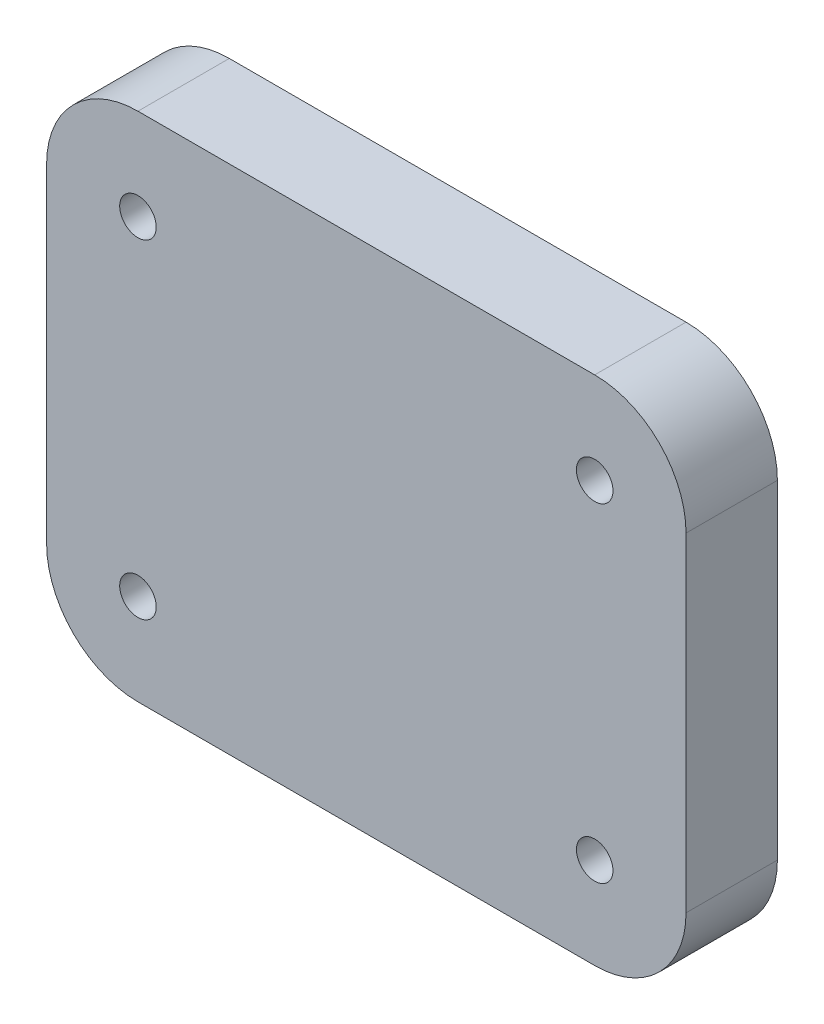
ISO-10303-21;
HEADER;
FILE_DESCRIPTION(('STEP AP214'),'2;1');
FILE_NAME('part.step','',(''),(''),'','','');
FILE_SCHEMA(('AUTOMOTIVE_DESIGN { 1 0 10303 214 1 1 1 1 }'));
ENDSEC;
DATA;
#1=APPLICATION_CONTEXT('core data for automotive mechanical design processes');
#2=APPLICATION_PROTOCOL_DEFINITION('international standard','automotive_design',2000,#1);
#3=PRODUCT_CONTEXT('',#1,'mechanical');
#4=PRODUCT('Part','Part','',(#3));
#5=PRODUCT_RELATED_PRODUCT_CATEGORY('part','',(#4));
#6=PRODUCT_DEFINITION_FORMATION('','',#4);
#7=PRODUCT_DEFINITION_CONTEXT('part definition',#1,'design');
#8=PRODUCT_DEFINITION('design','',#6,#7);
#9=PRODUCT_DEFINITION_SHAPE('','',#8);
#10=(LENGTH_UNIT() NAMED_UNIT(*) SI_UNIT(.MILLI.,.METRE.));
#11=(NAMED_UNIT(*) PLANE_ANGLE_UNIT() SI_UNIT($,.RADIAN.));
#12=(NAMED_UNIT(*) SI_UNIT($,.STERADIAN.) SOLID_ANGLE_UNIT());
#13=UNCERTAINTY_MEASURE_WITH_UNIT(LENGTH_MEASURE(1.E-05),#10,'distance_accuracy_value','');
#14=(GEOMETRIC_REPRESENTATION_CONTEXT(3) GLOBAL_UNCERTAINTY_ASSIGNED_CONTEXT((#13)) GLOBAL_UNIT_ASSIGNED_CONTEXT((#10,
#11,#12)) REPRESENTATION_CONTEXT('',''));
#15=CARTESIAN_POINT('',(0.,0.,0.));
#16=DIRECTION('',(0.,0.,1.));
#17=DIRECTION('',(1.,0.,0.));
#18=AXIS2_PLACEMENT_3D('',#15,#16,#17);
#19=CARTESIAN_POINT('',(17.5,14.,5.));
#20=DIRECTION('',(0.,-1.,0.));
#21=DIRECTION('',(0.,0.,-1.));
#22=AXIS2_PLACEMENT_3D('',#19,#20,#21);
#23=PLANE('',#22);
#24=DIRECTION('',(-1.,0.,0.));
#25=VECTOR('',#24,1.);
#26=CARTESIAN_POINT('',(17.5,14.,0.));
#27=LINE('',#26,#25);
#28=CARTESIAN_POINT('',(12.5,14.,0.));
#29=VERTEX_POINT('',#28);
#30=CARTESIAN_POINT('',(-12.5,14.,0.));
#31=VERTEX_POINT('',#30);
#32=EDGE_CURVE('E131',#29,#31,#27,.T.);
#33=ORIENTED_EDGE('',*,*,#32,.T.);
#34=DIRECTION('',(0.,0.,-1.));
#35=VECTOR('',#34,1.);
#36=CARTESIAN_POINT('',(-12.5,14.,5.));
#37=LINE('',#36,#35);
#38=CARTESIAN_POINT('',(-12.5,14.,5.));
#39=VERTEX_POINT('',#38);
#40=EDGE_CURVE('E153',#31,#39,#37,.F.);
#41=ORIENTED_EDGE('',*,*,#40,.T.);
#42=DIRECTION('',(-1.,0.,0.));
#43=VECTOR('',#42,1.);
#44=CARTESIAN_POINT('',(17.5,14.,5.));
#45=LINE('',#44,#43);
#46=CARTESIAN_POINT('',(12.5,14.,5.));
#47=VERTEX_POINT('',#46);
#48=EDGE_CURVE('E129',#47,#39,#45,.T.);
#49=ORIENTED_EDGE('',*,*,#48,.F.);
#50=DIRECTION('',(0.,0.,-1.));
#51=VECTOR('',#50,1.);
#52=CARTESIAN_POINT('',(12.5,14.,5.));
#53=LINE('',#52,#51);
#54=EDGE_CURVE('E150',#47,#29,#53,.T.);
#55=ORIENTED_EDGE('',*,*,#54,.T.);
#56=EDGE_LOOP('',(#33,#41,#49,#55));
#57=FACE_BOUND('',#56,.T.);
#58=ADVANCED_FACE('F34',(#57),#23,.F.);
#59=CARTESIAN_POINT('',(-17.5,14.,5.));
#60=DIRECTION('',(1.,0.,0.));
#61=DIRECTION('',(0.,0.,-1.));
#62=AXIS2_PLACEMENT_3D('',#59,#60,#61);
#63=PLANE('',#62);
#64=DIRECTION('',(0.,-1.,0.));
#65=VECTOR('',#64,1.);
#66=CARTESIAN_POINT('',(-17.5,14.,0.));
#67=LINE('',#66,#65);
#68=CARTESIAN_POINT('',(-17.5,9.,0.));
#69=VERTEX_POINT('',#68);
#70=CARTESIAN_POINT('',(-17.5,-9.,0.));
#71=VERTEX_POINT('',#70);
#72=EDGE_CURVE('E127',#69,#71,#67,.T.);
#73=ORIENTED_EDGE('',*,*,#72,.T.);
#74=DIRECTION('',(0.,0.,-1.));
#75=VECTOR('',#74,1.);
#76=CARTESIAN_POINT('',(-17.5,-9.,5.));
#77=LINE('',#76,#75);
#78=CARTESIAN_POINT('',(-17.5,-9.,5.));
#79=VERTEX_POINT('',#78);
#80=EDGE_CURVE('E105',#71,#79,#77,.F.);
#81=ORIENTED_EDGE('',*,*,#80,.T.);
#82=DIRECTION('',(0.,-1.,0.));
#83=VECTOR('',#82,1.);
#84=CARTESIAN_POINT('',(-17.5,14.,5.));
#85=LINE('',#84,#83);
#86=CARTESIAN_POINT('',(-17.5,9.,5.));
#87=VERTEX_POINT('',#86);
#88=EDGE_CURVE('E167',#87,#79,#85,.T.);
#89=ORIENTED_EDGE('',*,*,#88,.F.);
#90=DIRECTION('',(0.,0.,-1.));
#91=VECTOR('',#90,1.);
#92=CARTESIAN_POINT('',(-17.5,9.,5.));
#93=LINE('',#92,#91);
#94=EDGE_CURVE('E110',#87,#69,#93,.T.);
#95=ORIENTED_EDGE('',*,*,#94,.T.);
#96=EDGE_LOOP('',(#73,#81,#89,#95));
#97=FACE_BOUND('',#96,.T.);
#98=ADVANCED_FACE('F172',(#97),#63,.F.);
#99=CARTESIAN_POINT('',(-17.5,-14.,5.));
#100=DIRECTION('',(0.,1.,0.));
#101=DIRECTION('',(0.,0.,1.));
#102=AXIS2_PLACEMENT_3D('',#99,#100,#101);
#103=PLANE('',#102);
#104=DIRECTION('',(1.,0.,0.));
#105=VECTOR('',#104,1.);
#106=CARTESIAN_POINT('',(-17.5,-14.,5.));
#107=LINE('',#106,#105);
#108=CARTESIAN_POINT('',(-12.5,-14.,5.));
#109=VERTEX_POINT('',#108);
#110=CARTESIAN_POINT('',(12.5,-14.,5.));
#111=VERTEX_POINT('',#110);
#112=EDGE_CURVE('E119',#109,#111,#107,.T.);
#113=ORIENTED_EDGE('',*,*,#112,.F.);
#114=DIRECTION('',(0.,0.,-1.));
#115=VECTOR('',#114,1.);
#116=CARTESIAN_POINT('',(-12.5,-14.,5.));
#117=LINE('',#116,#115);
#118=CARTESIAN_POINT('',(-12.5,-14.,0.));
#119=VERTEX_POINT('',#118);
#120=EDGE_CURVE('E104',#109,#119,#117,.T.);
#121=ORIENTED_EDGE('',*,*,#120,.T.);
#122=DIRECTION('',(1.,0.,0.));
#123=VECTOR('',#122,1.);
#124=CARTESIAN_POINT('',(-17.5,-14.,0.));
#125=LINE('',#124,#123);
#126=CARTESIAN_POINT('',(12.5,-14.,0.));
#127=VERTEX_POINT('',#126);
#128=EDGE_CURVE('E117',#119,#127,#125,.T.);
#129=ORIENTED_EDGE('',*,*,#128,.T.);
#130=DIRECTION('',(0.,0.,-1.));
#131=VECTOR('',#130,1.);
#132=CARTESIAN_POINT('',(12.5,-14.,5.));
#133=LINE('',#132,#131);
#134=EDGE_CURVE('E121',#127,#111,#133,.F.);
#135=ORIENTED_EDGE('',*,*,#134,.T.);
#136=EDGE_LOOP('',(#113,#121,#129,#135));
#137=FACE_BOUND('',#136,.T.);
#138=ADVANCED_FACE('F116',(#137),#103,.F.);
#139=CARTESIAN_POINT('',(17.5,-14.,5.));
#140=DIRECTION('',(-1.,0.,0.));
#141=DIRECTION('',(0.,0.,1.));
#142=AXIS2_PLACEMENT_3D('',#139,#140,#141);
#143=PLANE('',#142);
#144=DIRECTION('',(0.,1.,0.));
#145=VECTOR('',#144,1.);
#146=CARTESIAN_POINT('',(17.5,-14.,5.));
#147=LINE('',#146,#145);
#148=CARTESIAN_POINT('',(17.5,-9.,5.));
#149=VERTEX_POINT('',#148);
#150=CARTESIAN_POINT('',(17.5,9.,5.));
#151=VERTEX_POINT('',#150);
#152=EDGE_CURVE('E135',#149,#151,#147,.T.);
#153=ORIENTED_EDGE('',*,*,#152,.F.);
#154=DIRECTION('',(0.,0.,-1.));
#155=VECTOR('',#154,1.);
#156=CARTESIAN_POINT('',(17.5,-9.,5.));
#157=LINE('',#156,#155);
#158=CARTESIAN_POINT('',(17.5,-9.,0.));
#159=VERTEX_POINT('',#158);
#160=EDGE_CURVE('E11',#149,#159,#157,.T.);
#161=ORIENTED_EDGE('',*,*,#160,.T.);
#162=DIRECTION('',(0.,1.,0.));
#163=VECTOR('',#162,1.);
#164=CARTESIAN_POINT('',(17.5,-14.,0.));
#165=LINE('',#164,#163);
#166=CARTESIAN_POINT('',(17.5,9.,0.));
#167=VERTEX_POINT('',#166);
#168=EDGE_CURVE('E126',#159,#167,#165,.T.);
#169=ORIENTED_EDGE('',*,*,#168,.T.);
#170=DIRECTION('',(0.,0.,-1.));
#171=VECTOR('',#170,1.);
#172=CARTESIAN_POINT('',(17.5,9.,5.));
#173=LINE('',#172,#171);
#174=EDGE_CURVE('E42',#167,#151,#173,.F.);
#175=ORIENTED_EDGE('',*,*,#174,.T.);
#176=EDGE_LOOP('',(#153,#161,#169,#175));
#177=FACE_BOUND('',#176,.T.);
#178=ADVANCED_FACE('F214',(#177),#143,.F.);
#179=CARTESIAN_POINT('',(0.,0.,5.));
#180=DIRECTION('',(0.,0.,1.));
#181=DIRECTION('',(1.,0.,0.));
#182=AXIS2_PLACEMENT_3D('',#179,#180,#181);
#183=PLANE('',#182);
#184=CARTESIAN_POINT('',(12.5,-9.,5.));
#185=DIRECTION('',(0.,0.,1.));
#186=DIRECTION('',(1.,0.,0.));
#187=AXIS2_PLACEMENT_3D('',#184,#185,#186);
#188=CIRCLE('',#187,0.999999999999999);
#189=CARTESIAN_POINT('',(13.5,-9.,5.));
#190=VERTEX_POINT('',#189);
#191=EDGE_CURVE('E184',#190,#190,#188,.T.);
#192=ORIENTED_EDGE('',*,*,#191,.F.);
#193=EDGE_LOOP('',(#192));
#194=FACE_BOUND('',#193,.T.);
#195=CARTESIAN_POINT('',(12.5,9.,5.));
#196=DIRECTION('',(0.,0.,1.));
#197=DIRECTION('',(1.,0.,0.));
#198=AXIS2_PLACEMENT_3D('',#195,#196,#197);
#199=CIRCLE('',#198,0.999999999999999);
#200=CARTESIAN_POINT('',(13.5,9.,5.));
#201=VERTEX_POINT('',#200);
#202=EDGE_CURVE('E190',#201,#201,#199,.T.);
#203=ORIENTED_EDGE('',*,*,#202,.F.);
#204=EDGE_LOOP('',(#203));
#205=FACE_BOUND('',#204,.T.);
#206=CARTESIAN_POINT('',(-12.5,9.,5.));
#207=DIRECTION('',(0.,0.,1.));
#208=DIRECTION('',(1.,0.,0.));
#209=AXIS2_PLACEMENT_3D('',#206,#207,#208);
#210=CIRCLE('',#209,1.);
#211=CARTESIAN_POINT('',(-11.5,9.,5.));
#212=VERTEX_POINT('',#211);
#213=EDGE_CURVE('E196',#212,#212,#210,.T.);
#214=ORIENTED_EDGE('',*,*,#213,.F.);
#215=EDGE_LOOP('',(#214));
#216=FACE_BOUND('',#215,.T.);
#217=CARTESIAN_POINT('',(-12.5,-9.,5.));
#218=DIRECTION('',(0.,0.,1.));
#219=DIRECTION('',(1.,0.,0.));
#220=AXIS2_PLACEMENT_3D('',#217,#218,#219);
#221=CIRCLE('',#220,1.);
#222=CARTESIAN_POINT('',(-11.5,-9.,5.));
#223=VERTEX_POINT('',#222);
#224=EDGE_CURVE('E175',#223,#223,#221,.T.);
#225=ORIENTED_EDGE('',*,*,#224,.F.);
#226=EDGE_LOOP('',(#225));
#227=FACE_BOUND('',#226,.T.);
#228=ORIENTED_EDGE('',*,*,#88,.T.);
#229=CARTESIAN_POINT('',(-12.5,-9.,5.));
#230=DIRECTION('',(0.,0.,1.));
#231=DIRECTION('',(1.,0.,0.));
#232=AXIS2_PLACEMENT_3D('',#229,#230,#231);
#233=CIRCLE('',#232,5.);
#234=EDGE_CURVE('E148',#79,#109,#233,.T.);
#235=ORIENTED_EDGE('',*,*,#234,.T.);
#236=ORIENTED_EDGE('',*,*,#112,.T.);
#237=CARTESIAN_POINT('',(12.5,-9.,5.));
#238=DIRECTION('',(0.,0.,1.));
#239=DIRECTION('',(1.,0.,0.));
#240=AXIS2_PLACEMENT_3D('',#237,#238,#239);
#241=CIRCLE('',#240,5.);
#242=EDGE_CURVE('E55',#111,#149,#241,.T.);
#243=ORIENTED_EDGE('',*,*,#242,.T.);
#244=ORIENTED_EDGE('',*,*,#152,.T.);
#245=CARTESIAN_POINT('',(12.5,9.,5.));
#246=DIRECTION('',(0.,0.,1.));
#247=DIRECTION('',(1.,0.,0.));
#248=AXIS2_PLACEMENT_3D('',#245,#246,#247);
#249=CIRCLE('',#248,5.);
#250=EDGE_CURVE('E143',#151,#47,#249,.T.);
#251=ORIENTED_EDGE('',*,*,#250,.T.);
#252=ORIENTED_EDGE('',*,*,#48,.T.);
#253=CARTESIAN_POINT('',(-12.5,9.,5.));
#254=DIRECTION('',(0.,0.,1.));
#255=DIRECTION('',(1.,0.,0.));
#256=AXIS2_PLACEMENT_3D('',#253,#254,#255);
#257=CIRCLE('',#256,5.);
#258=EDGE_CURVE('E146',#39,#87,#257,.T.);
#259=ORIENTED_EDGE('',*,*,#258,.T.);
#260=EDGE_LOOP('',(#228,#235,#236,#243,#244,#251,#252,#259));
#261=FACE_BOUND('',#260,.T.);
#262=ADVANCED_FACE('F164',(#194,#205,#216,#227,#261),#183,.T.);
#263=CARTESIAN_POINT('',(0.,0.,0.));
#264=DIRECTION('',(0.,0.,1.));
#265=DIRECTION('',(1.,0.,0.));
#266=AXIS2_PLACEMENT_3D('',#263,#264,#265);
#267=PLANE('',#266);
#268=CARTESIAN_POINT('',(12.5,-9.,0.));
#269=DIRECTION('',(0.,0.,1.));
#270=DIRECTION('',(1.,0.,0.));
#271=AXIS2_PLACEMENT_3D('',#268,#269,#270);
#272=CIRCLE('',#271,0.999999999999999);
#273=CARTESIAN_POINT('',(13.5,-9.,0.));
#274=VERTEX_POINT('',#273);
#275=EDGE_CURVE('E187',#274,#274,#272,.T.);
#276=ORIENTED_EDGE('',*,*,#275,.T.);
#277=EDGE_LOOP('',(#276));
#278=FACE_BOUND('',#277,.T.);
#279=CARTESIAN_POINT('',(12.5,9.,0.));
#280=DIRECTION('',(0.,0.,1.));
#281=DIRECTION('',(1.,0.,0.));
#282=AXIS2_PLACEMENT_3D('',#279,#280,#281);
#283=CIRCLE('',#282,0.999999999999999);
#284=CARTESIAN_POINT('',(13.5,9.,0.));
#285=VERTEX_POINT('',#284);
#286=EDGE_CURVE('E193',#285,#285,#283,.T.);
#287=ORIENTED_EDGE('',*,*,#286,.T.);
#288=EDGE_LOOP('',(#287));
#289=FACE_BOUND('',#288,.T.);
#290=CARTESIAN_POINT('',(-12.5,9.,0.));
#291=DIRECTION('',(0.,0.,1.));
#292=DIRECTION('',(1.,0.,0.));
#293=AXIS2_PLACEMENT_3D('',#290,#291,#292);
#294=CIRCLE('',#293,1.);
#295=CARTESIAN_POINT('',(-11.5,9.,0.));
#296=VERTEX_POINT('',#295);
#297=EDGE_CURVE('E182',#296,#296,#294,.T.);
#298=ORIENTED_EDGE('',*,*,#297,.T.);
#299=EDGE_LOOP('',(#298));
#300=FACE_BOUND('',#299,.T.);
#301=CARTESIAN_POINT('',(-12.5,-9.,0.));
#302=DIRECTION('',(0.,0.,1.));
#303=DIRECTION('',(1.,0.,0.));
#304=AXIS2_PLACEMENT_3D('',#301,#302,#303);
#305=CIRCLE('',#304,1.);
#306=CARTESIAN_POINT('',(-11.5,-9.,0.));
#307=VERTEX_POINT('',#306);
#308=EDGE_CURVE('E173',#307,#307,#305,.T.);
#309=ORIENTED_EDGE('',*,*,#308,.T.);
#310=EDGE_LOOP('',(#309));
#311=FACE_BOUND('',#310,.T.);
#312=ORIENTED_EDGE('',*,*,#128,.F.);
#313=CARTESIAN_POINT('',(-12.5,-9.,0.));
#314=DIRECTION('',(0.,0.,1.));
#315=DIRECTION('',(1.,0.,0.));
#316=AXIS2_PLACEMENT_3D('',#313,#314,#315);
#317=CIRCLE('',#316,5.);
#318=EDGE_CURVE('E100',#119,#71,#317,.F.);
#319=ORIENTED_EDGE('',*,*,#318,.T.);
#320=ORIENTED_EDGE('',*,*,#72,.F.);
#321=CARTESIAN_POINT('',(-12.5,9.,0.));
#322=DIRECTION('',(0.,0.,1.));
#323=DIRECTION('',(1.,0.,0.));
#324=AXIS2_PLACEMENT_3D('',#321,#322,#323);
#325=CIRCLE('',#324,5.);
#326=EDGE_CURVE('E111',#69,#31,#325,.F.);
#327=ORIENTED_EDGE('',*,*,#326,.T.);
#328=ORIENTED_EDGE('',*,*,#32,.F.);
#329=CARTESIAN_POINT('',(12.5,9.,0.));
#330=DIRECTION('',(0.,0.,1.));
#331=DIRECTION('',(1.,0.,0.));
#332=AXIS2_PLACEMENT_3D('',#329,#330,#331);
#333=CIRCLE('',#332,5.);
#334=EDGE_CURVE('E120',#29,#167,#333,.F.);
#335=ORIENTED_EDGE('',*,*,#334,.T.);
#336=ORIENTED_EDGE('',*,*,#168,.F.);
#337=CARTESIAN_POINT('',(12.5,-9.,0.));
#338=DIRECTION('',(0.,0.,1.));
#339=DIRECTION('',(1.,0.,0.));
#340=AXIS2_PLACEMENT_3D('',#337,#338,#339);
#341=CIRCLE('',#340,5.);
#342=EDGE_CURVE('E125',#159,#127,#341,.F.);
#343=ORIENTED_EDGE('',*,*,#342,.T.);
#344=EDGE_LOOP('',(#312,#319,#320,#327,#328,#335,#336,#343));
#345=FACE_BOUND('',#344,.T.);
#346=ADVANCED_FACE('F123',(#278,#289,#300,#311,#345),#267,.F.);
#347=CARTESIAN_POINT('',(-12.5,-9.,5.));
#348=DIRECTION('',(0.,0.,-1.));
#349=DIRECTION('',(-1.,0.,0.));
#350=AXIS2_PLACEMENT_3D('',#347,#348,#349);
#351=CYLINDRICAL_SURFACE('',#350,5.);
#352=ORIENTED_EDGE('',*,*,#234,.F.);
#353=ORIENTED_EDGE('',*,*,#80,.F.);
#354=ORIENTED_EDGE('',*,*,#318,.F.);
#355=ORIENTED_EDGE('',*,*,#120,.F.);
#356=EDGE_LOOP('',(#352,#353,#354,#355));
#357=FACE_BOUND('',#356,.T.);
#358=ADVANCED_FACE('F103',(#357),#351,.T.);
#359=CARTESIAN_POINT('',(-12.5,9.,5.));
#360=DIRECTION('',(0.,0.,-1.));
#361=DIRECTION('',(-1.,0.,0.));
#362=AXIS2_PLACEMENT_3D('',#359,#360,#361);
#363=CYLINDRICAL_SURFACE('',#362,5.);
#364=ORIENTED_EDGE('',*,*,#258,.F.);
#365=ORIENTED_EDGE('',*,*,#40,.F.);
#366=ORIENTED_EDGE('',*,*,#326,.F.);
#367=ORIENTED_EDGE('',*,*,#94,.F.);
#368=EDGE_LOOP('',(#364,#365,#366,#367));
#369=FACE_BOUND('',#368,.T.);
#370=ADVANCED_FACE('F170',(#369),#363,.T.);
#371=CARTESIAN_POINT('',(12.5,-9.,5.));
#372=DIRECTION('',(0.,0.,-1.));
#373=DIRECTION('',(-1.,0.,0.));
#374=AXIS2_PLACEMENT_3D('',#371,#372,#373);
#375=CYLINDRICAL_SURFACE('',#374,5.);
#376=ORIENTED_EDGE('',*,*,#242,.F.);
#377=ORIENTED_EDGE('',*,*,#134,.F.);
#378=ORIENTED_EDGE('',*,*,#342,.F.);
#379=ORIENTED_EDGE('',*,*,#160,.F.);
#380=EDGE_LOOP('',(#376,#377,#378,#379));
#381=FACE_BOUND('',#380,.T.);
#382=ADVANCED_FACE('F225',(#381),#375,.T.);
#383=CARTESIAN_POINT('',(12.5,9.,5.));
#384=DIRECTION('',(0.,0.,-1.));
#385=DIRECTION('',(-1.,0.,0.));
#386=AXIS2_PLACEMENT_3D('',#383,#384,#385);
#387=CYLINDRICAL_SURFACE('',#386,5.);
#388=ORIENTED_EDGE('',*,*,#250,.F.);
#389=ORIENTED_EDGE('',*,*,#174,.F.);
#390=ORIENTED_EDGE('',*,*,#334,.F.);
#391=ORIENTED_EDGE('',*,*,#54,.F.);
#392=EDGE_LOOP('',(#388,#389,#390,#391));
#393=FACE_BOUND('',#392,.T.);
#394=ADVANCED_FACE('F36',(#393),#387,.T.);
#395=CARTESIAN_POINT('',(-12.5,-9.,0.));
#396=DIRECTION('',(0.,0.,1.));
#397=DIRECTION('',(1.,0.,0.));
#398=AXIS2_PLACEMENT_3D('',#395,#396,#397);
#399=CYLINDRICAL_SURFACE('',#398,1.);
#400=ORIENTED_EDGE('',*,*,#308,.F.);
#401=EDGE_LOOP('',(#400));
#402=FACE_BOUND('',#401,.T.);
#403=ORIENTED_EDGE('',*,*,#224,.T.);
#404=EDGE_LOOP('',(#403));
#405=FACE_BOUND('',#404,.T.);
#406=ADVANCED_FACE('F208',(#402,#405),#399,.F.);
#407=CARTESIAN_POINT('',(-12.5,9.,0.));
#408=DIRECTION('',(0.,0.,1.));
#409=DIRECTION('',(1.,0.,0.));
#410=AXIS2_PLACEMENT_3D('',#407,#408,#409);
#411=CYLINDRICAL_SURFACE('',#410,1.);
#412=ORIENTED_EDGE('',*,*,#297,.F.);
#413=EDGE_LOOP('',(#412));
#414=FACE_BOUND('',#413,.T.);
#415=ORIENTED_EDGE('',*,*,#213,.T.);
#416=EDGE_LOOP('',(#415));
#417=FACE_BOUND('',#416,.T.);
#418=ADVANCED_FACE('F204',(#414,#417),#411,.F.);
#419=CARTESIAN_POINT('',(12.5,9.,0.));
#420=DIRECTION('',(0.,0.,1.));
#421=DIRECTION('',(1.,0.,0.));
#422=AXIS2_PLACEMENT_3D('',#419,#420,#421);
#423=CYLINDRICAL_SURFACE('',#422,0.999999999999999);
#424=ORIENTED_EDGE('',*,*,#286,.F.);
#425=EDGE_LOOP('',(#424));
#426=FACE_BOUND('',#425,.T.);
#427=ORIENTED_EDGE('',*,*,#202,.T.);
#428=EDGE_LOOP('',(#427));
#429=FACE_BOUND('',#428,.T.);
#430=ADVANCED_FACE('F207',(#426,#429),#423,.F.);
#431=CARTESIAN_POINT('',(12.5,-9.,0.));
#432=DIRECTION('',(0.,0.,1.));
#433=DIRECTION('',(1.,0.,0.));
#434=AXIS2_PLACEMENT_3D('',#431,#432,#433);
#435=CYLINDRICAL_SURFACE('',#434,0.999999999999999);
#436=ORIENTED_EDGE('',*,*,#275,.F.);
#437=EDGE_LOOP('',(#436));
#438=FACE_BOUND('',#437,.T.);
#439=ORIENTED_EDGE('',*,*,#191,.T.);
#440=EDGE_LOOP('',(#439));
#441=FACE_BOUND('',#440,.T.);
#442=ADVANCED_FACE('F261',(#438,#441),#435,.F.);
#443=CLOSED_SHELL('',(#58,#98,#138,#178,#262,#346,#358,#370,#382,#394,#406,#418,#430,#442));
#444=MANIFOLD_SOLID_BREP('B2',#443);
#445=ADVANCED_BREP_SHAPE_REPRESENTATION('',(#18,#444),#14);
#446=SHAPE_DEFINITION_REPRESENTATION(#9,#445);
ENDSEC;
END-ISO-10303-21;
